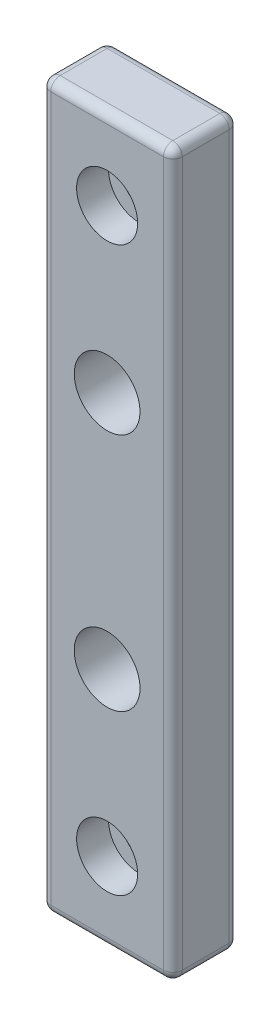
ISO-10303-21;
HEADER;
FILE_DESCRIPTION(('STEP AP214'),'2;1');
FILE_NAME('part.step','',(''),(''),'','','');
FILE_SCHEMA(('AUTOMOTIVE_DESIGN { 1 0 10303 214 1 1 1 1 }'));
ENDSEC;
DATA;
#1=APPLICATION_CONTEXT('core data for automotive mechanical design processes');
#2=APPLICATION_PROTOCOL_DEFINITION('international standard','automotive_design',2000,#1);
#3=PRODUCT_CONTEXT('',#1,'mechanical');
#4=PRODUCT('Part','Part','',(#3));
#5=PRODUCT_RELATED_PRODUCT_CATEGORY('part','',(#4));
#6=PRODUCT_DEFINITION_FORMATION('','',#4);
#7=PRODUCT_DEFINITION_CONTEXT('part definition',#1,'design');
#8=PRODUCT_DEFINITION('design','',#6,#7);
#9=PRODUCT_DEFINITION_SHAPE('','',#8);
#10=(LENGTH_UNIT() NAMED_UNIT(*) SI_UNIT(.MILLI.,.METRE.));
#11=(NAMED_UNIT(*) PLANE_ANGLE_UNIT() SI_UNIT($,.RADIAN.));
#12=(NAMED_UNIT(*) SI_UNIT($,.STERADIAN.) SOLID_ANGLE_UNIT());
#13=UNCERTAINTY_MEASURE_WITH_UNIT(LENGTH_MEASURE(1.E-05),#10,'distance_accuracy_value','');
#14=(GEOMETRIC_REPRESENTATION_CONTEXT(3) GLOBAL_UNCERTAINTY_ASSIGNED_CONTEXT((#13)) GLOBAL_UNIT_ASSIGNED_CONTEXT((#10,
#11,#12)) REPRESENTATION_CONTEXT('',''));
#15=CARTESIAN_POINT('',(0.,0.,0.));
#16=DIRECTION('',(0.,0.,1.));
#17=DIRECTION('',(1.,0.,0.));
#18=AXIS2_PLACEMENT_3D('',#15,#16,#17);
#19=CARTESIAN_POINT('',(-7.,38.5,3.5));
#20=DIRECTION('',(1.,0.,0.));
#21=DIRECTION('',(0.,1.,0.));
#22=AXIS2_PLACEMENT_3D('',#19,#20,#21);
#23=PLANE('',#22);
#24=DIRECTION('',(0.,0.,-1.));
#25=VECTOR('',#24,1.);
#26=CARTESIAN_POINT('',(-6.99999999999999,-37.5,3.5));
#27=LINE('',#26,#25);
#28=CARTESIAN_POINT('',(-6.99999999999999,-37.5,-2.5));
#29=VERTEX_POINT('',#28);
#30=CARTESIAN_POINT('',(-6.99999999999999,-37.5,2.5));
#31=VERTEX_POINT('',#30);
#32=EDGE_CURVE('E254',#29,#31,#27,.F.);
#33=ORIENTED_EDGE('',*,*,#32,.T.);
#34=DIRECTION('',(0.,-1.,0.));
#35=VECTOR('',#34,1.);
#36=CARTESIAN_POINT('',(-7.,37.5,2.5));
#37=LINE('',#36,#35);
#38=CARTESIAN_POINT('',(-7.,37.5,2.5));
#39=VERTEX_POINT('',#38);
#40=EDGE_CURVE('E286',#31,#39,#37,.F.);
#41=ORIENTED_EDGE('',*,*,#40,.T.);
#42=DIRECTION('',(0.,0.,-1.));
#43=VECTOR('',#42,1.);
#44=CARTESIAN_POINT('',(-7.,37.5,3.5));
#45=LINE('',#44,#43);
#46=CARTESIAN_POINT('',(-7.,37.5,-2.5));
#47=VERTEX_POINT('',#46);
#48=EDGE_CURVE('E257',#39,#47,#45,.T.);
#49=ORIENTED_EDGE('',*,*,#48,.T.);
#50=DIRECTION('',(0.,-1.,0.));
#51=VECTOR('',#50,1.);
#52=CARTESIAN_POINT('',(-7.,38.5,-2.5));
#53=LINE('',#52,#51);
#54=EDGE_CURVE('E284',#47,#29,#53,.T.);
#55=ORIENTED_EDGE('',*,*,#54,.T.);
#56=EDGE_LOOP('',(#33,#41,#49,#55));
#57=FACE_BOUND('',#56,.T.);
#58=ADVANCED_FACE('F35',(#57),#23,.F.);
#59=CARTESIAN_POINT('',(-6.99999999999999,-38.5,3.5));
#60=DIRECTION('',(0.,1.,0.));
#61=DIRECTION('',(0.,0.,1.));
#62=AXIS2_PLACEMENT_3D('',#59,#60,#61);
#63=PLANE('',#62);
#64=DIRECTION('',(0.,0.,-1.));
#65=VECTOR('',#64,1.);
#66=CARTESIAN_POINT('',(6.,-38.5,3.5));
#67=LINE('',#66,#65);
#68=CARTESIAN_POINT('',(6.,-38.5,-2.5));
#69=VERTEX_POINT('',#68);
#70=CARTESIAN_POINT('',(6.,-38.5,2.5));
#71=VERTEX_POINT('',#70);
#72=EDGE_CURVE('E131',#69,#71,#67,.F.);
#73=ORIENTED_EDGE('',*,*,#72,.T.);
#74=DIRECTION('',(1.,0.,0.));
#75=VECTOR('',#74,1.);
#76=CARTESIAN_POINT('',(-5.99999999999999,-38.5,2.5));
#77=LINE('',#76,#75);
#78=CARTESIAN_POINT('',(-5.99999999999999,-38.5,2.5));
#79=VERTEX_POINT('',#78);
#80=EDGE_CURVE('E135',#71,#79,#77,.F.);
#81=ORIENTED_EDGE('',*,*,#80,.T.);
#82=DIRECTION('',(0.,0.,-1.));
#83=VECTOR('',#82,1.);
#84=CARTESIAN_POINT('',(-5.99999999999999,-38.5,3.5));
#85=LINE('',#84,#83);
#86=CARTESIAN_POINT('',(-5.99999999999999,-38.5,-2.5));
#87=VERTEX_POINT('',#86);
#88=EDGE_CURVE('E133',#79,#87,#85,.T.);
#89=ORIENTED_EDGE('',*,*,#88,.T.);
#90=DIRECTION('',(1.,0.,0.));
#91=VECTOR('',#90,1.);
#92=CARTESIAN_POINT('',(-6.99999999999999,-38.5,-2.5));
#93=LINE('',#92,#91);
#94=EDGE_CURVE('E128',#87,#69,#93,.T.);
#95=ORIENTED_EDGE('',*,*,#94,.T.);
#96=EDGE_LOOP('',(#73,#81,#89,#95));
#97=FACE_BOUND('',#96,.T.);
#98=ADVANCED_FACE('F130',(#97),#63,.F.);
#99=CARTESIAN_POINT('',(7.,38.5,3.5));
#100=DIRECTION('',(-1.,0.,0.));
#101=DIRECTION('',(0.,-1.,0.));
#102=AXIS2_PLACEMENT_3D('',#99,#100,#101);
#103=PLANE('',#102);
#104=DIRECTION('',(0.,0.,-1.));
#105=VECTOR('',#104,1.);
#106=CARTESIAN_POINT('',(7.,37.5,3.5));
#107=LINE('',#106,#105);
#108=CARTESIAN_POINT('',(7.,37.5,-2.5));
#109=VERTEX_POINT('',#108);
#110=CARTESIAN_POINT('',(7.,37.5,2.5));
#111=VERTEX_POINT('',#110);
#112=EDGE_CURVE('E266',#109,#111,#107,.F.);
#113=ORIENTED_EDGE('',*,*,#112,.T.);
#114=DIRECTION('',(0.,1.,0.));
#115=VECTOR('',#114,1.);
#116=CARTESIAN_POINT('',(7.,-37.5,2.5));
#117=LINE('',#116,#115);
#118=CARTESIAN_POINT('',(7.,-37.5,2.5));
#119=VERTEX_POINT('',#118);
#120=EDGE_CURVE('E11',#111,#119,#117,.F.);
#121=ORIENTED_EDGE('',*,*,#120,.T.);
#122=DIRECTION('',(0.,0.,-1.));
#123=VECTOR('',#122,1.);
#124=CARTESIAN_POINT('',(7.,-37.5,3.5));
#125=LINE('',#124,#123);
#126=CARTESIAN_POINT('',(7.,-37.5,-2.5));
#127=VERTEX_POINT('',#126);
#128=EDGE_CURVE('E157',#119,#127,#125,.T.);
#129=ORIENTED_EDGE('',*,*,#128,.T.);
#130=DIRECTION('',(0.,1.,0.));
#131=VECTOR('',#130,1.);
#132=CARTESIAN_POINT('',(7.,38.5,-2.5));
#133=LINE('',#132,#131);
#134=EDGE_CURVE('E44',#127,#109,#133,.T.);
#135=ORIENTED_EDGE('',*,*,#134,.T.);
#136=EDGE_LOOP('',(#113,#121,#129,#135));
#137=FACE_BOUND('',#136,.T.);
#138=ADVANCED_FACE('F307',(#137),#103,.F.);
#139=CARTESIAN_POINT('',(-7.,38.5,3.5));
#140=DIRECTION('',(0.,-1.,0.));
#141=DIRECTION('',(0.,0.,-1.));
#142=AXIS2_PLACEMENT_3D('',#139,#140,#141);
#143=PLANE('',#142);
#144=DIRECTION('',(0.,0.,-1.));
#145=VECTOR('',#144,1.);
#146=CARTESIAN_POINT('',(-6.,38.5,3.5));
#147=LINE('',#146,#145);
#148=CARTESIAN_POINT('',(-6.,38.5,-2.5));
#149=VERTEX_POINT('',#148);
#150=CARTESIAN_POINT('',(-6.,38.5,2.5));
#151=VERTEX_POINT('',#150);
#152=EDGE_CURVE('E148',#149,#151,#147,.F.);
#153=ORIENTED_EDGE('',*,*,#152,.T.);
#154=DIRECTION('',(-1.,0.,0.));
#155=VECTOR('',#154,1.);
#156=CARTESIAN_POINT('',(6.,38.5,2.5));
#157=LINE('',#156,#155);
#158=CARTESIAN_POINT('',(6.,38.5,2.5));
#159=VERTEX_POINT('',#158);
#160=EDGE_CURVE('E294',#151,#159,#157,.F.);
#161=ORIENTED_EDGE('',*,*,#160,.T.);
#162=DIRECTION('',(0.,0.,-1.));
#163=VECTOR('',#162,1.);
#164=CARTESIAN_POINT('',(6.,38.5,3.5));
#165=LINE('',#164,#163);
#166=CARTESIAN_POINT('',(6.,38.5,-2.5));
#167=VERTEX_POINT('',#166);
#168=EDGE_CURVE('E260',#159,#167,#165,.T.);
#169=ORIENTED_EDGE('',*,*,#168,.T.);
#170=DIRECTION('',(-1.,0.,0.));
#171=VECTOR('',#170,1.);
#172=CARTESIAN_POINT('',(-7.,38.5,-2.5));
#173=LINE('',#172,#171);
#174=EDGE_CURVE('E292',#167,#149,#173,.T.);
#175=ORIENTED_EDGE('',*,*,#174,.T.);
#176=EDGE_LOOP('',(#153,#161,#169,#175));
#177=FACE_BOUND('',#176,.T.);
#178=ADVANCED_FACE('F326',(#177),#143,.F.);
#179=CARTESIAN_POINT('',(0.,0.,3.5));
#180=DIRECTION('',(0.,0.,1.));
#181=DIRECTION('',(1.,0.,0.));
#182=AXIS2_PLACEMENT_3D('',#179,#180,#181);
#183=PLANE('',#182);
#184=DIRECTION('',(0.,-1.,0.));
#185=VECTOR('',#184,1.);
#186=CARTESIAN_POINT('',(-6.,-37.5,3.5));
#187=LINE('',#186,#185);
#188=CARTESIAN_POINT('',(-6.,37.5,3.5));
#189=VERTEX_POINT('',#188);
#190=CARTESIAN_POINT('',(-6.,-37.5,3.5));
#191=VERTEX_POINT('',#190);
#192=EDGE_CURVE('E275',#189,#191,#187,.T.);
#193=ORIENTED_EDGE('',*,*,#192,.T.);
#194=DIRECTION('',(1.,0.,0.));
#195=VECTOR('',#194,1.);
#196=CARTESIAN_POINT('',(6.,-37.5,3.5));
#197=LINE('',#196,#195);
#198=CARTESIAN_POINT('',(6.,-37.5,3.5));
#199=VERTEX_POINT('',#198);
#200=EDGE_CURVE('E136',#191,#199,#197,.T.);
#201=ORIENTED_EDGE('',*,*,#200,.T.);
#202=DIRECTION('',(0.,1.,0.));
#203=VECTOR('',#202,1.);
#204=CARTESIAN_POINT('',(6.,37.5,3.5));
#205=LINE('',#204,#203);
#206=CARTESIAN_POINT('',(6.,37.5,3.5));
#207=VERTEX_POINT('',#206);
#208=EDGE_CURVE('E271',#199,#207,#205,.T.);
#209=ORIENTED_EDGE('',*,*,#208,.T.);
#210=DIRECTION('',(-1.,0.,0.));
#211=VECTOR('',#210,1.);
#212=CARTESIAN_POINT('',(-6.,37.5,3.5));
#213=LINE('',#212,#211);
#214=EDGE_CURVE('E273',#207,#189,#213,.T.);
#215=ORIENTED_EDGE('',*,*,#214,.T.);
#216=EDGE_LOOP('',(#193,#201,#209,#215));
#217=FACE_BOUND('',#216,.T.);
#218=CARTESIAN_POINT('',(0.,12.75,3.5));
#219=DIRECTION('',(0.,0.,1.));
#220=DIRECTION('',(-1.,0.,0.));
#221=AXIS2_PLACEMENT_3D('',#218,#219,#220);
#222=CIRCLE('',#221,3.5);
#223=CARTESIAN_POINT('',(-3.5,12.75,3.5));
#224=VERTEX_POINT('',#223);
#225=EDGE_CURVE('E212',#224,#224,#222,.T.);
#226=ORIENTED_EDGE('',*,*,#225,.F.);
#227=EDGE_LOOP('',(#226));
#228=FACE_BOUND('',#227,.T.);
#229=CARTESIAN_POINT('',(0.,-12.75,3.5));
#230=DIRECTION('',(0.,0.,1.));
#231=DIRECTION('',(1.,0.,0.));
#232=AXIS2_PLACEMENT_3D('',#229,#230,#231);
#233=CIRCLE('',#232,3.5);
#234=CARTESIAN_POINT('',(3.5,-12.75,3.5));
#235=VERTEX_POINT('',#234);
#236=EDGE_CURVE('E222',#235,#235,#233,.T.);
#237=ORIENTED_EDGE('',*,*,#236,.F.);
#238=EDGE_LOOP('',(#237));
#239=FACE_BOUND('',#238,.T.);
#240=CARTESIAN_POINT('',(0.,-30.,3.5));
#241=DIRECTION('',(0.,0.,1.));
#242=DIRECTION('',(1.,0.,0.));
#243=AXIS2_PLACEMENT_3D('',#240,#241,#242);
#244=CIRCLE('',#243,3.25);
#245=CARTESIAN_POINT('',(3.25,-30.,3.5));
#246=VERTEX_POINT('',#245);
#247=EDGE_CURVE('E228',#246,#246,#244,.T.);
#248=ORIENTED_EDGE('',*,*,#247,.F.);
#249=EDGE_LOOP('',(#248));
#250=FACE_BOUND('',#249,.T.);
#251=CARTESIAN_POINT('',(0.,30.,3.5));
#252=DIRECTION('',(0.,0.,1.));
#253=DIRECTION('',(1.,0.,0.));
#254=AXIS2_PLACEMENT_3D('',#251,#252,#253);
#255=CIRCLE('',#254,3.25);
#256=CARTESIAN_POINT('',(3.25,30.,3.5));
#257=VERTEX_POINT('',#256);
#258=EDGE_CURVE('E242',#257,#257,#255,.T.);
#259=ORIENTED_EDGE('',*,*,#258,.F.);
#260=EDGE_LOOP('',(#259));
#261=FACE_BOUND('',#260,.T.);
#262=ADVANCED_FACE('F351',(#217,#228,#239,#250,#261),#183,.T.);
#263=CARTESIAN_POINT('',(0.,0.,-3.5));
#264=DIRECTION('',(0.,0.,1.));
#265=DIRECTION('',(1.,0.,0.));
#266=AXIS2_PLACEMENT_3D('',#263,#264,#265);
#267=PLANE('',#266);
#268=DIRECTION('',(0.,1.,0.));
#269=VECTOR('',#268,1.);
#270=CARTESIAN_POINT('',(6.,0.,-3.5));
#271=LINE('',#270,#269);
#272=CARTESIAN_POINT('',(6.,37.5,-3.5));
#273=VERTEX_POINT('',#272);
#274=CARTESIAN_POINT('',(6.,-37.5,-3.5));
#275=VERTEX_POINT('',#274);
#276=EDGE_CURVE('E300',#273,#275,#271,.F.);
#277=ORIENTED_EDGE('',*,*,#276,.T.);
#278=DIRECTION('',(1.,0.,0.));
#279=VECTOR('',#278,1.);
#280=CARTESIAN_POINT('',(0.,-37.5,-3.5));
#281=LINE('',#280,#279);
#282=CARTESIAN_POINT('',(-5.99999999999999,-37.5,-3.5));
#283=VERTEX_POINT('',#282);
#284=EDGE_CURVE('E160',#275,#283,#281,.F.);
#285=ORIENTED_EDGE('',*,*,#284,.T.);
#286=DIRECTION('',(0.,-1.,0.));
#287=VECTOR('',#286,1.);
#288=CARTESIAN_POINT('',(-6.,0.,-3.5));
#289=LINE('',#288,#287);
#290=CARTESIAN_POINT('',(-6.,37.5,-3.5));
#291=VERTEX_POINT('',#290);
#292=EDGE_CURVE('E60',#283,#291,#289,.F.);
#293=ORIENTED_EDGE('',*,*,#292,.T.);
#294=DIRECTION('',(-1.,0.,0.));
#295=VECTOR('',#294,1.);
#296=CARTESIAN_POINT('',(0.,37.5,-3.5));
#297=LINE('',#296,#295);
#298=EDGE_CURVE('E302',#291,#273,#297,.F.);
#299=ORIENTED_EDGE('',*,*,#298,.T.);
#300=EDGE_LOOP('',(#277,#285,#293,#299));
#301=FACE_BOUND('',#300,.T.);
#302=CARTESIAN_POINT('',(0.,12.75,-3.5));
#303=DIRECTION('',(0.,0.,1.));
#304=DIRECTION('',(-1.,0.,0.));
#305=AXIS2_PLACEMENT_3D('',#302,#303,#304);
#306=CIRCLE('',#305,3.5);
#307=CARTESIAN_POINT('',(-3.5,12.75,-3.5));
#308=VERTEX_POINT('',#307);
#309=EDGE_CURVE('E217',#308,#308,#306,.T.);
#310=ORIENTED_EDGE('',*,*,#309,.T.);
#311=EDGE_LOOP('',(#310));
#312=FACE_BOUND('',#311,.T.);
#313=CARTESIAN_POINT('',(0.,-12.75,-3.5));
#314=DIRECTION('',(0.,0.,1.));
#315=DIRECTION('',(1.,0.,0.));
#316=AXIS2_PLACEMENT_3D('',#313,#314,#315);
#317=CIRCLE('',#316,3.5);
#318=CARTESIAN_POINT('',(3.5,-12.75,-3.5));
#319=VERTEX_POINT('',#318);
#320=EDGE_CURVE('E225',#319,#319,#317,.T.);
#321=ORIENTED_EDGE('',*,*,#320,.T.);
#322=EDGE_LOOP('',(#321));
#323=FACE_BOUND('',#322,.T.);
#324=CARTESIAN_POINT('',(0.,-30.,-3.5));
#325=DIRECTION('',(0.,0.,1.));
#326=DIRECTION('',(1.,0.,0.));
#327=AXIS2_PLACEMENT_3D('',#324,#325,#326);
#328=CIRCLE('',#327,1.6);
#329=CARTESIAN_POINT('',(1.6,-30.,-3.5));
#330=VERTEX_POINT('',#329);
#331=EDGE_CURVE('E239',#330,#330,#328,.T.);
#332=ORIENTED_EDGE('',*,*,#331,.T.);
#333=EDGE_LOOP('',(#332));
#334=FACE_BOUND('',#333,.T.);
#335=CARTESIAN_POINT('',(0.,30.,-3.5));
#336=DIRECTION('',(0.,0.,1.));
#337=DIRECTION('',(1.,0.,0.));
#338=AXIS2_PLACEMENT_3D('',#335,#336,#337);
#339=CIRCLE('',#338,1.6);
#340=CARTESIAN_POINT('',(1.6,30.,-3.5));
#341=VERTEX_POINT('',#340);
#342=EDGE_CURVE('E251',#341,#341,#339,.T.);
#343=ORIENTED_EDGE('',*,*,#342,.T.);
#344=EDGE_LOOP('',(#343));
#345=FACE_BOUND('',#344,.T.);
#346=ADVANCED_FACE('F321',(#301,#312,#323,#334,#345),#267,.F.);
#347=CARTESIAN_POINT('',(0.,30.,3.5));
#348=DIRECTION('',(0.,0.,1.));
#349=DIRECTION('',(1.,0.,0.));
#350=AXIS2_PLACEMENT_3D('',#347,#348,#349);
#351=CYLINDRICAL_SURFACE('',#350,1.6);
#352=ORIENTED_EDGE('',*,*,#342,.F.);
#353=EDGE_LOOP('',(#352));
#354=FACE_BOUND('',#353,.T.);
#355=CARTESIAN_POINT('',(0.,30.,0.100000000000001));
#356=DIRECTION('',(0.,0.,1.));
#357=DIRECTION('',(1.,0.,0.));
#358=AXIS2_PLACEMENT_3D('',#355,#356,#357);
#359=CIRCLE('',#358,1.6);
#360=CARTESIAN_POINT('',(1.6,30.,0.100000000000001));
#361=VERTEX_POINT('',#360);
#362=EDGE_CURVE('E248',#361,#361,#359,.T.);
#363=ORIENTED_EDGE('',*,*,#362,.T.);
#364=EDGE_LOOP('',(#363));
#365=FACE_BOUND('',#364,.T.);
#366=ADVANCED_FACE('F600',(#354,#365),#351,.F.);
#367=CARTESIAN_POINT('',(1.6,30.,0.100000000000001));
#368=DIRECTION('',(0.,0.,-1.));
#369=DIRECTION('',(-1.,0.,0.));
#370=AXIS2_PLACEMENT_3D('',#367,#368,#369);
#371=PLANE('',#370);
#372=ORIENTED_EDGE('',*,*,#362,.F.);
#373=EDGE_LOOP('',(#372));
#374=FACE_BOUND('',#373,.T.);
#375=CARTESIAN_POINT('',(0.,30.,0.100000000000001));
#376=DIRECTION('',(0.,0.,1.));
#377=DIRECTION('',(1.,0.,0.));
#378=AXIS2_PLACEMENT_3D('',#375,#376,#377);
#379=CIRCLE('',#378,3.25);
#380=CARTESIAN_POINT('',(3.25,30.,0.100000000000001));
#381=VERTEX_POINT('',#380);
#382=EDGE_CURVE('E245',#381,#381,#379,.T.);
#383=ORIENTED_EDGE('',*,*,#382,.T.);
#384=EDGE_LOOP('',(#383));
#385=FACE_BOUND('',#384,.T.);
#386=ADVANCED_FACE('F591',(#374,#385),#371,.F.);
#387=CARTESIAN_POINT('',(0.,30.,3.5));
#388=DIRECTION('',(0.,0.,1.));
#389=DIRECTION('',(1.,0.,0.));
#390=AXIS2_PLACEMENT_3D('',#387,#388,#389);
#391=CYLINDRICAL_SURFACE('',#390,3.25);
#392=ORIENTED_EDGE('',*,*,#382,.F.);
#393=EDGE_LOOP('',(#392));
#394=FACE_BOUND('',#393,.T.);
#395=ORIENTED_EDGE('',*,*,#258,.T.);
#396=EDGE_LOOP('',(#395));
#397=FACE_BOUND('',#396,.T.);
#398=ADVANCED_FACE('F582',(#394,#397),#391,.F.);
#399=CARTESIAN_POINT('',(0.,-30.,3.5));
#400=DIRECTION('',(0.,0.,1.));
#401=DIRECTION('',(1.,0.,0.));
#402=AXIS2_PLACEMENT_3D('',#399,#400,#401);
#403=CYLINDRICAL_SURFACE('',#402,1.6);
#404=ORIENTED_EDGE('',*,*,#331,.F.);
#405=EDGE_LOOP('',(#404));
#406=FACE_BOUND('',#405,.T.);
#407=CARTESIAN_POINT('',(0.,-30.,0.100000000000001));
#408=DIRECTION('',(0.,0.,1.));
#409=DIRECTION('',(1.,0.,0.));
#410=AXIS2_PLACEMENT_3D('',#407,#408,#409);
#411=CIRCLE('',#410,1.6);
#412=CARTESIAN_POINT('',(1.6,-30.,0.100000000000001));
#413=VERTEX_POINT('',#412);
#414=EDGE_CURVE('E236',#413,#413,#411,.T.);
#415=ORIENTED_EDGE('',*,*,#414,.T.);
#416=EDGE_LOOP('',(#415));
#417=FACE_BOUND('',#416,.T.);
#418=ADVANCED_FACE('F573',(#406,#417),#403,.F.);
#419=CARTESIAN_POINT('',(1.6,-30.,0.100000000000001));
#420=DIRECTION('',(0.,0.,-1.));
#421=DIRECTION('',(-1.,0.,0.));
#422=AXIS2_PLACEMENT_3D('',#419,#420,#421);
#423=PLANE('',#422);
#424=ORIENTED_EDGE('',*,*,#414,.F.);
#425=EDGE_LOOP('',(#424));
#426=FACE_BOUND('',#425,.T.);
#427=CARTESIAN_POINT('',(0.,-30.,0.100000000000001));
#428=DIRECTION('',(0.,0.,1.));
#429=DIRECTION('',(1.,0.,0.));
#430=AXIS2_PLACEMENT_3D('',#427,#428,#429);
#431=CIRCLE('',#430,3.25);
#432=CARTESIAN_POINT('',(3.25,-30.,0.100000000000001));
#433=VERTEX_POINT('',#432);
#434=EDGE_CURVE('E233',#433,#433,#431,.T.);
#435=ORIENTED_EDGE('',*,*,#434,.T.);
#436=EDGE_LOOP('',(#435));
#437=FACE_BOUND('',#436,.T.);
#438=ADVANCED_FACE('F564',(#426,#437),#423,.F.);
#439=CARTESIAN_POINT('',(0.,-30.,3.5));
#440=DIRECTION('',(0.,0.,1.));
#441=DIRECTION('',(1.,0.,0.));
#442=AXIS2_PLACEMENT_3D('',#439,#440,#441);
#443=CYLINDRICAL_SURFACE('',#442,3.25);
#444=ORIENTED_EDGE('',*,*,#434,.F.);
#445=EDGE_LOOP('',(#444));
#446=FACE_BOUND('',#445,.T.);
#447=ORIENTED_EDGE('',*,*,#247,.T.);
#448=EDGE_LOOP('',(#447));
#449=FACE_BOUND('',#448,.T.);
#450=ADVANCED_FACE('F555',(#446,#449),#443,.F.);
#451=CARTESIAN_POINT('',(0.,-12.75,-3.5));
#452=DIRECTION('',(0.,0.,1.));
#453=DIRECTION('',(1.,0.,0.));
#454=AXIS2_PLACEMENT_3D('',#451,#452,#453);
#455=CYLINDRICAL_SURFACE('',#454,3.5);
#456=ORIENTED_EDGE('',*,*,#320,.F.);
#457=EDGE_LOOP('',(#456));
#458=FACE_BOUND('',#457,.T.);
#459=ORIENTED_EDGE('',*,*,#236,.T.);
#460=EDGE_LOOP('',(#459));
#461=FACE_BOUND('',#460,.T.);
#462=ADVANCED_FACE('F546',(#458,#461),#455,.F.);
#463=CARTESIAN_POINT('',(0.,12.75,-3.5));
#464=DIRECTION('',(0.,0.,1.));
#465=DIRECTION('',(1.,0.,0.));
#466=AXIS2_PLACEMENT_3D('',#463,#464,#465);
#467=CYLINDRICAL_SURFACE('',#466,3.5);
#468=ORIENTED_EDGE('',*,*,#309,.F.);
#469=EDGE_LOOP('',(#468));
#470=FACE_BOUND('',#469,.T.);
#471=ORIENTED_EDGE('',*,*,#225,.T.);
#472=EDGE_LOOP('',(#471));
#473=FACE_BOUND('',#472,.T.);
#474=ADVANCED_FACE('F383',(#470,#473),#467,.F.);
#475=CARTESIAN_POINT('',(-6.,37.5,3.5));
#476=DIRECTION('',(0.,0.,-1.));
#477=DIRECTION('',(-1.,0.,0.));
#478=AXIS2_PLACEMENT_3D('',#475,#476,#477);
#479=CYLINDRICAL_SURFACE('',#478,1.);
#480=ORIENTED_EDGE('',*,*,#48,.F.);
#481=CARTESIAN_POINT('',(-6.,37.5,2.5));
#482=DIRECTION('',(0.,0.,-1.));
#483=DIRECTION('',(-1.,0.,0.));
#484=AXIS2_PLACEMENT_3D('',#481,#482,#483);
#485=CIRCLE('',#484,1.);
#486=EDGE_CURVE('E290',#39,#151,#485,.T.);
#487=ORIENTED_EDGE('',*,*,#486,.T.);
#488=ORIENTED_EDGE('',*,*,#152,.F.);
#489=CARTESIAN_POINT('',(-6.,37.5,-2.5));
#490=DIRECTION('',(0.,0.,-1.));
#491=DIRECTION('',(-1.,0.,0.));
#492=AXIS2_PLACEMENT_3D('',#489,#490,#491);
#493=CIRCLE('',#492,1.);
#494=EDGE_CURVE('E288',#149,#47,#493,.F.);
#495=ORIENTED_EDGE('',*,*,#494,.T.);
#496=EDGE_LOOP('',(#480,#487,#488,#495));
#497=FACE_BOUND('',#496,.T.);
#498=ADVANCED_FACE('F330',(#497),#479,.T.);
#499=CARTESIAN_POINT('',(-5.99999999999999,-37.5,3.5));
#500=DIRECTION('',(0.,0.,-1.));
#501=DIRECTION('',(-1.,0.,0.));
#502=AXIS2_PLACEMENT_3D('',#499,#500,#501);
#503=CYLINDRICAL_SURFACE('',#502,1.);
#504=ORIENTED_EDGE('',*,*,#88,.F.);
#505=CARTESIAN_POINT('',(-5.99999999999999,-37.5,2.5));
#506=DIRECTION('',(0.,0.,-1.));
#507=DIRECTION('',(-1.,0.,0.));
#508=AXIS2_PLACEMENT_3D('',#505,#506,#507);
#509=CIRCLE('',#508,1.);
#510=EDGE_CURVE('E282',#79,#31,#509,.T.);
#511=ORIENTED_EDGE('',*,*,#510,.T.);
#512=ORIENTED_EDGE('',*,*,#32,.F.);
#513=CARTESIAN_POINT('',(-5.99999999999999,-37.5,-2.5));
#514=DIRECTION('',(0.,0.,-1.));
#515=DIRECTION('',(-1.,0.,0.));
#516=AXIS2_PLACEMENT_3D('',#513,#514,#515);
#517=CIRCLE('',#516,1.);
#518=EDGE_CURVE('E280',#29,#87,#517,.F.);
#519=ORIENTED_EDGE('',*,*,#518,.T.);
#520=EDGE_LOOP('',(#504,#511,#512,#519));
#521=FACE_BOUND('',#520,.T.);
#522=ADVANCED_FACE('F339',(#521),#503,.T.);
#523=CARTESIAN_POINT('',(6.,-37.5,3.5));
#524=DIRECTION('',(0.,0.,-1.));
#525=DIRECTION('',(-1.,0.,0.));
#526=AXIS2_PLACEMENT_3D('',#523,#524,#525);
#527=CYLINDRICAL_SURFACE('',#526,1.);
#528=ORIENTED_EDGE('',*,*,#128,.F.);
#529=CARTESIAN_POINT('',(6.,-37.5,2.5));
#530=DIRECTION('',(0.,0.,-1.));
#531=DIRECTION('',(-1.,0.,0.));
#532=AXIS2_PLACEMENT_3D('',#529,#530,#531);
#533=CIRCLE('',#532,1.);
#534=EDGE_CURVE('E147',#119,#71,#533,.T.);
#535=ORIENTED_EDGE('',*,*,#534,.T.);
#536=ORIENTED_EDGE('',*,*,#72,.F.);
#537=CARTESIAN_POINT('',(6.,-37.5,-2.5));
#538=DIRECTION('',(0.,0.,-1.));
#539=DIRECTION('',(-1.,0.,0.));
#540=AXIS2_PLACEMENT_3D('',#537,#538,#539);
#541=CIRCLE('',#540,1.);
#542=EDGE_CURVE('E144',#69,#127,#541,.F.);
#543=ORIENTED_EDGE('',*,*,#542,.T.);
#544=EDGE_LOOP('',(#528,#535,#536,#543));
#545=FACE_BOUND('',#544,.T.);
#546=ADVANCED_FACE('F143',(#545),#527,.T.);
#547=CARTESIAN_POINT('',(6.,37.5,3.5));
#548=DIRECTION('',(0.,0.,-1.));
#549=DIRECTION('',(-1.,0.,0.));
#550=AXIS2_PLACEMENT_3D('',#547,#548,#549);
#551=CYLINDRICAL_SURFACE('',#550,1.);
#552=ORIENTED_EDGE('',*,*,#168,.F.);
#553=CARTESIAN_POINT('',(6.,37.5,2.5));
#554=DIRECTION('',(0.,0.,-1.));
#555=DIRECTION('',(-1.,0.,0.));
#556=AXIS2_PLACEMENT_3D('',#553,#554,#555);
#557=CIRCLE('',#556,1.);
#558=EDGE_CURVE('E298',#159,#111,#557,.T.);
#559=ORIENTED_EDGE('',*,*,#558,.T.);
#560=ORIENTED_EDGE('',*,*,#112,.F.);
#561=CARTESIAN_POINT('',(6.,37.5,-2.5));
#562=DIRECTION('',(0.,0.,-1.));
#563=DIRECTION('',(-1.,0.,0.));
#564=AXIS2_PLACEMENT_3D('',#561,#562,#563);
#565=CIRCLE('',#564,1.);
#566=EDGE_CURVE('E296',#109,#167,#565,.F.);
#567=ORIENTED_EDGE('',*,*,#566,.T.);
#568=EDGE_LOOP('',(#552,#559,#560,#567));
#569=FACE_BOUND('',#568,.T.);
#570=ADVANCED_FACE('F313',(#569),#551,.T.);
#571=CARTESIAN_POINT('',(-6.,37.5,2.5));
#572=DIRECTION('',(0.,0.,1.));
#573=DIRECTION('',(1.,0.,0.));
#574=AXIS2_PLACEMENT_3D('',#571,#572,#573);
#575=SPHERICAL_SURFACE('',#574,1.);
#576=CARTESIAN_POINT('',(-6.,37.5,2.5));
#577=DIRECTION('',(1.,0.,0.));
#578=DIRECTION('',(0.,0.,-1.));
#579=AXIS2_PLACEMENT_3D('',#576,#577,#578);
#580=CIRCLE('',#579,1.);
#581=EDGE_CURVE('E204',#151,#189,#580,.T.);
#582=ORIENTED_EDGE('',*,*,#581,.F.);
#583=ORIENTED_EDGE('',*,*,#486,.F.);
#584=CARTESIAN_POINT('',(-6.,37.5,2.5));
#585=DIRECTION('',(0.,-1.,0.));
#586=DIRECTION('',(0.,0.,-1.));
#587=AXIS2_PLACEMENT_3D('',#584,#585,#586);
#588=CIRCLE('',#587,1.);
#589=EDGE_CURVE('E164',#189,#39,#588,.T.);
#590=ORIENTED_EDGE('',*,*,#589,.F.);
#591=EDGE_LOOP('',(#582,#583,#590));
#592=FACE_BOUND('',#591,.T.);
#593=ADVANCED_FACE('F355',(#592),#575,.T.);
#594=CARTESIAN_POINT('',(-6.,0.,2.5));
#595=DIRECTION('',(0.,1.,0.));
#596=DIRECTION('',(-1.,0.,0.));
#597=AXIS2_PLACEMENT_3D('',#594,#595,#596);
#598=CYLINDRICAL_SURFACE('',#597,1.);
#599=ORIENTED_EDGE('',*,*,#589,.T.);
#600=ORIENTED_EDGE('',*,*,#40,.F.);
#601=CARTESIAN_POINT('',(-6.,-37.5,2.5));
#602=DIRECTION('',(0.,-1.,0.));
#603=DIRECTION('',(1.,0.,0.));
#604=AXIS2_PLACEMENT_3D('',#601,#602,#603);
#605=CIRCLE('',#604,1.);
#606=EDGE_CURVE('E202',#191,#31,#605,.T.);
#607=ORIENTED_EDGE('',*,*,#606,.F.);
#608=ORIENTED_EDGE('',*,*,#192,.F.);
#609=EDGE_LOOP('',(#599,#600,#607,#608));
#610=FACE_BOUND('',#609,.T.);
#611=ADVANCED_FACE('F353',(#610),#598,.T.);
#612=CARTESIAN_POINT('',(0.,37.5,2.5));
#613=DIRECTION('',(1.,0.,0.));
#614=DIRECTION('',(0.,0.,-1.));
#615=AXIS2_PLACEMENT_3D('',#612,#613,#614);
#616=CYLINDRICAL_SURFACE('',#615,1.);
#617=ORIENTED_EDGE('',*,*,#581,.T.);
#618=ORIENTED_EDGE('',*,*,#214,.F.);
#619=CARTESIAN_POINT('',(6.,37.5,2.5));
#620=DIRECTION('',(1.,0.,0.));
#621=DIRECTION('',(0.,0.,-1.));
#622=AXIS2_PLACEMENT_3D('',#619,#620,#621);
#623=CIRCLE('',#622,1.);
#624=EDGE_CURVE('E199',#159,#207,#623,.T.);
#625=ORIENTED_EDGE('',*,*,#624,.F.);
#626=ORIENTED_EDGE('',*,*,#160,.F.);
#627=EDGE_LOOP('',(#617,#618,#625,#626));
#628=FACE_BOUND('',#627,.T.);
#629=ADVANCED_FACE('F357',(#628),#616,.T.);
#630=CARTESIAN_POINT('',(-5.99999999999999,-37.5,2.5));
#631=DIRECTION('',(0.,0.,1.));
#632=DIRECTION('',(1.,0.,0.));
#633=AXIS2_PLACEMENT_3D('',#630,#631,#632);
#634=SPHERICAL_SURFACE('',#633,1.);
#635=ORIENTED_EDGE('',*,*,#606,.T.);
#636=ORIENTED_EDGE('',*,*,#510,.F.);
#637=CARTESIAN_POINT('',(-5.99999999999999,-37.5,2.5));
#638=DIRECTION('',(1.,0.,0.));
#639=DIRECTION('',(0.,0.,-1.));
#640=AXIS2_PLACEMENT_3D('',#637,#638,#639);
#641=CIRCLE('',#640,1.);
#642=EDGE_CURVE('E196',#191,#79,#641,.T.);
#643=ORIENTED_EDGE('',*,*,#642,.F.);
#644=EDGE_LOOP('',(#635,#636,#643));
#645=FACE_BOUND('',#644,.T.);
#646=ADVANCED_FACE('F343',(#645),#634,.T.);
#647=CARTESIAN_POINT('',(6.,37.5,2.5));
#648=DIRECTION('',(0.,0.,1.));
#649=DIRECTION('',(1.,0.,0.));
#650=AXIS2_PLACEMENT_3D('',#647,#648,#649);
#651=SPHERICAL_SURFACE('',#650,1.);
#652=ORIENTED_EDGE('',*,*,#558,.F.);
#653=ORIENTED_EDGE('',*,*,#624,.T.);
#654=CARTESIAN_POINT('',(6.,37.5,2.5));
#655=DIRECTION('',(0.,-1.,0.));
#656=DIRECTION('',(0.,0.,-1.));
#657=AXIS2_PLACEMENT_3D('',#654,#655,#656);
#658=CIRCLE('',#657,1.);
#659=EDGE_CURVE('E190',#111,#207,#658,.T.);
#660=ORIENTED_EDGE('',*,*,#659,.F.);
#661=EDGE_LOOP('',(#652,#653,#660));
#662=FACE_BOUND('',#661,.T.);
#663=ADVANCED_FACE('F359',(#662),#651,.T.);
#664=CARTESIAN_POINT('',(0.,-37.5,2.5));
#665=DIRECTION('',(-1.,0.,0.));
#666=DIRECTION('',(0.,0.,1.));
#667=AXIS2_PLACEMENT_3D('',#664,#665,#666);
#668=CYLINDRICAL_SURFACE('',#667,1.);
#669=ORIENTED_EDGE('',*,*,#642,.T.);
#670=ORIENTED_EDGE('',*,*,#80,.F.);
#671=CARTESIAN_POINT('',(6.,-37.5,2.5));
#672=DIRECTION('',(1.,0.,0.));
#673=DIRECTION('',(0.,0.,-1.));
#674=AXIS2_PLACEMENT_3D('',#671,#672,#673);
#675=CIRCLE('',#674,1.);
#676=EDGE_CURVE('E185',#199,#71,#675,.T.);
#677=ORIENTED_EDGE('',*,*,#676,.F.);
#678=ORIENTED_EDGE('',*,*,#200,.F.);
#679=EDGE_LOOP('',(#669,#670,#677,#678));
#680=FACE_BOUND('',#679,.T.);
#681=ADVANCED_FACE('F348',(#680),#668,.T.);
#682=CARTESIAN_POINT('',(6.,0.,2.5));
#683=DIRECTION('',(0.,-1.,0.));
#684=DIRECTION('',(1.,0.,0.));
#685=AXIS2_PLACEMENT_3D('',#682,#683,#684);
#686=CYLINDRICAL_SURFACE('',#685,1.);
#687=ORIENTED_EDGE('',*,*,#659,.T.);
#688=ORIENTED_EDGE('',*,*,#208,.F.);
#689=CARTESIAN_POINT('',(6.,-37.5,2.5));
#690=DIRECTION('',(0.,-1.,0.));
#691=DIRECTION('',(0.,0.,-1.));
#692=AXIS2_PLACEMENT_3D('',#689,#690,#691);
#693=CIRCLE('',#692,1.);
#694=EDGE_CURVE('E181',#119,#199,#693,.T.);
#695=ORIENTED_EDGE('',*,*,#694,.F.);
#696=ORIENTED_EDGE('',*,*,#120,.F.);
#697=EDGE_LOOP('',(#687,#688,#695,#696));
#698=FACE_BOUND('',#697,.T.);
#699=ADVANCED_FACE('F362',(#698),#686,.T.);
#700=CARTESIAN_POINT('',(6.,-37.5,2.5));
#701=DIRECTION('',(0.,0.,1.));
#702=DIRECTION('',(1.,0.,0.));
#703=AXIS2_PLACEMENT_3D('',#700,#701,#702);
#704=SPHERICAL_SURFACE('',#703,1.);
#705=ORIENTED_EDGE('',*,*,#676,.T.);
#706=ORIENTED_EDGE('',*,*,#534,.F.);
#707=ORIENTED_EDGE('',*,*,#694,.T.);
#708=EDGE_LOOP('',(#705,#706,#707));
#709=FACE_BOUND('',#708,.T.);
#710=ADVANCED_FACE('F363',(#709),#704,.T.);
#711=CARTESIAN_POINT('',(-6.,37.5,-2.5));
#712=DIRECTION('',(0.,0.,1.));
#713=DIRECTION('',(1.,0.,0.));
#714=AXIS2_PLACEMENT_3D('',#711,#712,#713);
#715=SPHERICAL_SURFACE('',#714,1.);
#716=CARTESIAN_POINT('',(-6.,37.5,-2.5));
#717=DIRECTION('',(0.,-1.,0.));
#718=DIRECTION('',(0.,0.,-1.));
#719=AXIS2_PLACEMENT_3D('',#716,#717,#718);
#720=CIRCLE('',#719,1.);
#721=EDGE_CURVE('E175',#47,#291,#720,.T.);
#722=ORIENTED_EDGE('',*,*,#721,.F.);
#723=ORIENTED_EDGE('',*,*,#494,.F.);
#724=CARTESIAN_POINT('',(-6.,37.5,-2.5));
#725=DIRECTION('',(1.,0.,0.));
#726=DIRECTION('',(0.,0.,-1.));
#727=AXIS2_PLACEMENT_3D('',#724,#725,#726);
#728=CIRCLE('',#727,1.);
#729=EDGE_CURVE('E39',#291,#149,#728,.T.);
#730=ORIENTED_EDGE('',*,*,#729,.F.);
#731=EDGE_LOOP('',(#722,#723,#730));
#732=FACE_BOUND('',#731,.T.);
#733=ADVANCED_FACE('F37',(#732),#715,.T.);
#734=CARTESIAN_POINT('',(-7.,37.5,-2.5));
#735=DIRECTION('',(-1.,0.,0.));
#736=DIRECTION('',(0.,0.,1.));
#737=AXIS2_PLACEMENT_3D('',#734,#735,#736);
#738=CYLINDRICAL_SURFACE('',#737,1.);
#739=ORIENTED_EDGE('',*,*,#729,.T.);
#740=ORIENTED_EDGE('',*,*,#174,.F.);
#741=CARTESIAN_POINT('',(6.,37.5,-2.5));
#742=DIRECTION('',(1.,0.,0.));
#743=DIRECTION('',(0.,0.,-1.));
#744=AXIS2_PLACEMENT_3D('',#741,#742,#743);
#745=CIRCLE('',#744,1.);
#746=EDGE_CURVE('E173',#273,#167,#745,.T.);
#747=ORIENTED_EDGE('',*,*,#746,.F.);
#748=ORIENTED_EDGE('',*,*,#298,.F.);
#749=EDGE_LOOP('',(#739,#740,#747,#748));
#750=FACE_BOUND('',#749,.T.);
#751=ADVANCED_FACE('F323',(#750),#738,.T.);
#752=CARTESIAN_POINT('',(-6.,38.5,-2.5));
#753=DIRECTION('',(0.,-1.,0.));
#754=DIRECTION('',(1.,0.,0.));
#755=AXIS2_PLACEMENT_3D('',#752,#753,#754);
#756=CYLINDRICAL_SURFACE('',#755,1.);
#757=ORIENTED_EDGE('',*,*,#721,.T.);
#758=ORIENTED_EDGE('',*,*,#292,.F.);
#759=CARTESIAN_POINT('',(-5.99999999999999,-37.5,-2.5));
#760=DIRECTION('',(0.,-1.,0.));
#761=DIRECTION('',(0.,0.,-1.));
#762=AXIS2_PLACEMENT_3D('',#759,#760,#761);
#763=CIRCLE('',#762,1.);
#764=EDGE_CURVE('E171',#29,#283,#763,.T.);
#765=ORIENTED_EDGE('',*,*,#764,.F.);
#766=ORIENTED_EDGE('',*,*,#54,.F.);
#767=EDGE_LOOP('',(#757,#758,#765,#766));
#768=FACE_BOUND('',#767,.T.);
#769=ADVANCED_FACE('F334',(#768),#756,.T.);
#770=CARTESIAN_POINT('',(6.,37.5,-2.5));
#771=DIRECTION('',(0.,0.,1.));
#772=DIRECTION('',(1.,0.,0.));
#773=AXIS2_PLACEMENT_3D('',#770,#771,#772);
#774=SPHERICAL_SURFACE('',#773,1.);
#775=ORIENTED_EDGE('',*,*,#746,.T.);
#776=ORIENTED_EDGE('',*,*,#566,.F.);
#777=CARTESIAN_POINT('',(6.,37.5,-2.5));
#778=DIRECTION('',(0.,-1.,0.));
#779=DIRECTION('',(0.,0.,-1.));
#780=AXIS2_PLACEMENT_3D('',#777,#778,#779);
#781=CIRCLE('',#780,1.);
#782=EDGE_CURVE('E168',#273,#109,#781,.T.);
#783=ORIENTED_EDGE('',*,*,#782,.F.);
#784=EDGE_LOOP('',(#775,#776,#783));
#785=FACE_BOUND('',#784,.T.);
#786=ADVANCED_FACE('F317',(#785),#774,.T.);
#787=CARTESIAN_POINT('',(-5.99999999999999,-37.5,-2.5));
#788=DIRECTION('',(0.,0.,1.));
#789=DIRECTION('',(1.,0.,0.));
#790=AXIS2_PLACEMENT_3D('',#787,#788,#789);
#791=SPHERICAL_SURFACE('',#790,1.);
#792=ORIENTED_EDGE('',*,*,#518,.F.);
#793=ORIENTED_EDGE('',*,*,#764,.T.);
#794=CARTESIAN_POINT('',(-5.99999999999999,-37.5,-2.5));
#795=DIRECTION('',(1.,0.,0.));
#796=DIRECTION('',(0.,0.,-1.));
#797=AXIS2_PLACEMENT_3D('',#794,#795,#796);
#798=CIRCLE('',#797,1.);
#799=EDGE_CURVE('E52',#87,#283,#798,.T.);
#800=ORIENTED_EDGE('',*,*,#799,.F.);
#801=EDGE_LOOP('',(#792,#793,#800));
#802=FACE_BOUND('',#801,.T.);
#803=ADVANCED_FACE('F404',(#802),#791,.T.);
#804=CARTESIAN_POINT('',(6.,38.5,-2.5));
#805=DIRECTION('',(0.,1.,0.));
#806=DIRECTION('',(-1.,0.,0.));
#807=AXIS2_PLACEMENT_3D('',#804,#805,#806);
#808=CYLINDRICAL_SURFACE('',#807,1.);
#809=ORIENTED_EDGE('',*,*,#782,.T.);
#810=ORIENTED_EDGE('',*,*,#134,.F.);
#811=CARTESIAN_POINT('',(6.,-37.5,-2.5));
#812=DIRECTION('',(0.,-1.,0.));
#813=DIRECTION('',(0.,0.,-1.));
#814=AXIS2_PLACEMENT_3D('',#811,#812,#813);
#815=CIRCLE('',#814,1.);
#816=EDGE_CURVE('E155',#275,#127,#815,.T.);
#817=ORIENTED_EDGE('',*,*,#816,.F.);
#818=ORIENTED_EDGE('',*,*,#276,.F.);
#819=EDGE_LOOP('',(#809,#810,#817,#818));
#820=FACE_BOUND('',#819,.T.);
#821=ADVANCED_FACE('F320',(#820),#808,.T.);
#822=CARTESIAN_POINT('',(-6.99999999999999,-37.5,-2.5));
#823=DIRECTION('',(1.,0.,0.));
#824=DIRECTION('',(0.,0.,-1.));
#825=AXIS2_PLACEMENT_3D('',#822,#823,#824);
#826=CYLINDRICAL_SURFACE('',#825,1.);
#827=ORIENTED_EDGE('',*,*,#799,.T.);
#828=ORIENTED_EDGE('',*,*,#284,.F.);
#829=CARTESIAN_POINT('',(6.,-37.5,-2.5));
#830=DIRECTION('',(1.,0.,0.));
#831=DIRECTION('',(0.,0.,-1.));
#832=AXIS2_PLACEMENT_3D('',#829,#830,#831);
#833=CIRCLE('',#832,1.);
#834=EDGE_CURVE('E153',#69,#275,#833,.T.);
#835=ORIENTED_EDGE('',*,*,#834,.F.);
#836=ORIENTED_EDGE('',*,*,#94,.F.);
#837=EDGE_LOOP('',(#827,#828,#835,#836));
#838=FACE_BOUND('',#837,.T.);
#839=ADVANCED_FACE('F159',(#838),#826,.T.);
#840=CARTESIAN_POINT('',(6.,-37.5,-2.5));
#841=DIRECTION('',(0.,0.,1.));
#842=DIRECTION('',(1.,0.,0.));
#843=AXIS2_PLACEMENT_3D('',#840,#841,#842);
#844=SPHERICAL_SURFACE('',#843,1.);
#845=ORIENTED_EDGE('',*,*,#816,.T.);
#846=ORIENTED_EDGE('',*,*,#542,.F.);
#847=ORIENTED_EDGE('',*,*,#834,.T.);
#848=EDGE_LOOP('',(#845,#846,#847));
#849=FACE_BOUND('',#848,.T.);
#850=ADVANCED_FACE('F152',(#849),#844,.T.);
#851=CLOSED_SHELL('',(#58,#98,#138,#178,#262,#346,#366,#386,#398,#418,#438,#450,#462,#474,#498,
#522,#546,#570,#593,#611,#629,#646,#663,#681,#699,#710,#733,#751,#769,#786,#803,#821,#839,#850));
#852=MANIFOLD_SOLID_BREP('B2',#851);
#853=ADVANCED_BREP_SHAPE_REPRESENTATION('',(#18,#852),#14);
#854=SHAPE_DEFINITION_REPRESENTATION(#9,#853);
ENDSEC;
END-ISO-10303-21;
